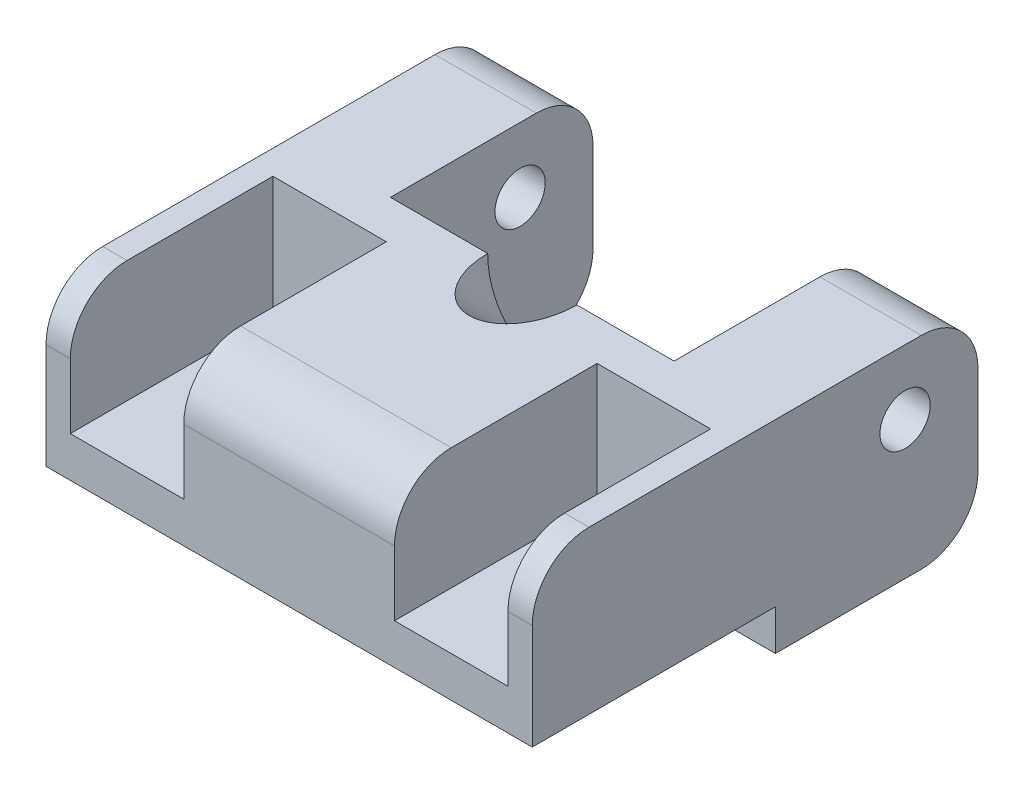
ISO-10303-21;
HEADER;
FILE_DESCRIPTION(('STEP AP214'),'2;1');
FILE_NAME('part.step','',(''),(''),'','','');
FILE_SCHEMA(('AUTOMOTIVE_DESIGN { 1 0 10303 214 1 1 1 1 }'));
ENDSEC;
DATA;
#1=APPLICATION_CONTEXT('core data for automotive mechanical design processes');
#2=APPLICATION_PROTOCOL_DEFINITION('international standard','automotive_design',2000,#1);
#3=PRODUCT_CONTEXT('',#1,'mechanical');
#4=PRODUCT('Part','Part','',(#3));
#5=PRODUCT_RELATED_PRODUCT_CATEGORY('part','',(#4));
#6=PRODUCT_DEFINITION_FORMATION('','',#4);
#7=PRODUCT_DEFINITION_CONTEXT('part definition',#1,'design');
#8=PRODUCT_DEFINITION('design','',#6,#7);
#9=PRODUCT_DEFINITION_SHAPE('','',#8);
#10=(LENGTH_UNIT() NAMED_UNIT(*) SI_UNIT(.MILLI.,.METRE.));
#11=(NAMED_UNIT(*) PLANE_ANGLE_UNIT() SI_UNIT($,.RADIAN.));
#12=(NAMED_UNIT(*) SI_UNIT($,.STERADIAN.) SOLID_ANGLE_UNIT());
#13=UNCERTAINTY_MEASURE_WITH_UNIT(LENGTH_MEASURE(1.E-05),#10,'distance_accuracy_value','');
#14=(GEOMETRIC_REPRESENTATION_CONTEXT(3) GLOBAL_UNCERTAINTY_ASSIGNED_CONTEXT((#13)) GLOBAL_UNIT_ASSIGNED_CONTEXT((#10,
#11,#12)) REPRESENTATION_CONTEXT('',''));
#15=CARTESIAN_POINT('',(0.,0.,0.));
#16=DIRECTION('',(0.,0.,1.));
#17=DIRECTION('',(1.,0.,0.));
#18=AXIS2_PLACEMENT_3D('',#15,#16,#17);
#19=CARTESIAN_POINT('',(0.,-5.,0.));
#20=DIRECTION('',(0.,1.,0.));
#21=DIRECTION('',(0.,0.,1.));
#22=AXIS2_PLACEMENT_3D('',#19,#20,#21);
#23=PLANE('',#22);
#24=DIRECTION('',(0.,0.,1.));
#25=VECTOR('',#24,1.);
#26=CARTESIAN_POINT('',(47.5,-5.,-55.));
#27=LINE('',#26,#25);
#28=CARTESIAN_POINT('',(47.5,-5.,-48.));
#29=VERTEX_POINT('',#28);
#30=CARTESIAN_POINT('',(47.5,-5.,-30.));
#31=VERTEX_POINT('',#30);
#32=EDGE_CURVE('E238',#29,#31,#27,.T.);
#33=ORIENTED_EDGE('',*,*,#32,.F.);
#34=DIRECTION('',(-1.,0.,0.));
#35=VECTOR('',#34,1.);
#36=CARTESIAN_POINT('',(0.,-5.,-48.));
#37=LINE('',#36,#35);
#38=CARTESIAN_POINT('',(60.,-5.,-48.));
#39=VERTEX_POINT('',#38);
#40=EDGE_CURVE('E41',#29,#39,#37,.F.);
#41=ORIENTED_EDGE('',*,*,#40,.T.);
#42=DIRECTION('',(0.,0.,-1.));
#43=VECTOR('',#42,1.);
#44=CARTESIAN_POINT('',(60.,-5.,0.));
#45=LINE('',#44,#43);
#46=CARTESIAN_POINT('',(60.,-5.,-30.));
#47=VERTEX_POINT('',#46);
#48=EDGE_CURVE('E235',#47,#39,#45,.T.);
#49=ORIENTED_EDGE('',*,*,#48,.F.);
#50=DIRECTION('',(-1.,0.,0.));
#51=VECTOR('',#50,1.);
#52=CARTESIAN_POINT('',(90.4138126514911,-5.,-30.));
#53=LINE('',#52,#51);
#54=EDGE_CURVE('E433',#47,#31,#53,.T.);
#55=ORIENTED_EDGE('',*,*,#54,.T.);
#56=EDGE_LOOP('',(#33,#41,#49,#55));
#57=FACE_BOUND('',#56,.T.);
#58=ADVANCED_FACE('F33',(#57),#23,.F.);
#59=CARTESIAN_POINT('',(0.,5.,0.));
#60=DIRECTION('',(0.,-1.,0.));
#61=DIRECTION('',(0.,0.,-1.));
#62=AXIS2_PLACEMENT_3D('',#59,#60,#61);
#63=PLANE('',#62);
#64=CARTESIAN_POINT('',(50.,5.,-15.));
#65=DIRECTION('',(0.,1.,0.));
#66=DIRECTION('',(0.,0.,1.));
#67=AXIS2_PLACEMENT_3D('',#64,#65,#66);
#68=CIRCLE('',#67,2.5);
#69=CARTESIAN_POINT('',(50.,5.,-12.5));
#70=VERTEX_POINT('',#69);
#71=EDGE_CURVE('E284',#70,#70,#68,.T.);
#72=ORIENTED_EDGE('',*,*,#71,.F.);
#73=EDGE_LOOP('',(#72));
#74=FACE_BOUND('',#73,.T.);
#75=DIRECTION('',(1.,0.,0.));
#76=VECTOR('',#75,1.);
#77=CARTESIAN_POINT('',(0.,5.,0.));
#78=LINE('',#77,#76);
#79=CARTESIAN_POINT('',(43.,5.,0.));
#80=VERTEX_POINT('',#79);
#81=CARTESIAN_POINT('',(57.,5.,0.));
#82=VERTEX_POINT('',#81);
#83=EDGE_CURVE('E290',#80,#82,#78,.T.);
#84=ORIENTED_EDGE('',*,*,#83,.T.);
#85=DIRECTION('',(0.,0.,-1.));
#86=VECTOR('',#85,1.);
#87=CARTESIAN_POINT('',(57.,5.,0.));
#88=LINE('',#87,#86);
#89=CARTESIAN_POINT('',(57.,5.,-25.));
#90=VERTEX_POINT('',#89);
#91=EDGE_CURVE('E271',#82,#90,#88,.T.);
#92=ORIENTED_EDGE('',*,*,#91,.T.);
#93=DIRECTION('',(-1.,0.,0.));
#94=VECTOR('',#93,1.);
#95=CARTESIAN_POINT('',(0.,5.,-25.));
#96=LINE('',#95,#94);
#97=CARTESIAN_POINT('',(43.,5.,-25.));
#98=VERTEX_POINT('',#97);
#99=EDGE_CURVE('E275',#90,#98,#96,.T.);
#100=ORIENTED_EDGE('',*,*,#99,.T.);
#101=DIRECTION('',(0.,0.,1.));
#102=VECTOR('',#101,1.);
#103=CARTESIAN_POINT('',(43.,5.,0.));
#104=LINE('',#103,#102);
#105=EDGE_CURVE('E269',#98,#80,#104,.T.);
#106=ORIENTED_EDGE('',*,*,#105,.T.);
#107=EDGE_LOOP('',(#84,#92,#100,#106));
#108=FACE_BOUND('',#107,.T.);
#109=ADVANCED_FACE('F560',(#74,#108),#63,.F.);
#110=CARTESIAN_POINT('',(3.,5.,0.));
#111=VERTEX_POINT('',#110);
#112=CARTESIAN_POINT('',(17.,5.,0.));
#113=VERTEX_POINT('',#112);
#114=EDGE_CURVE('E292',#111,#113,#78,.T.);
#115=ORIENTED_EDGE('',*,*,#114,.T.);
#116=DIRECTION('',(0.,0.,-1.));
#117=VECTOR('',#116,1.);
#118=CARTESIAN_POINT('',(17.,5.,0.));
#119=LINE('',#118,#117);
#120=CARTESIAN_POINT('',(17.,5.,-25.));
#121=VERTEX_POINT('',#120);
#122=EDGE_CURVE('E267',#113,#121,#119,.T.);
#123=ORIENTED_EDGE('',*,*,#122,.T.);
#124=DIRECTION('',(-1.,0.,0.));
#125=VECTOR('',#124,1.);
#126=CARTESIAN_POINT('',(0.,5.,-25.));
#127=LINE('',#126,#125);
#128=CARTESIAN_POINT('',(3.,5.,-25.));
#129=VERTEX_POINT('',#128);
#130=EDGE_CURVE('E273',#121,#129,#127,.T.);
#131=ORIENTED_EDGE('',*,*,#130,.T.);
#132=DIRECTION('',(0.,0.,1.));
#133=VECTOR('',#132,1.);
#134=CARTESIAN_POINT('',(3.,5.,0.));
#135=LINE('',#134,#133);
#136=EDGE_CURVE('E247',#129,#111,#135,.T.);
#137=ORIENTED_EDGE('',*,*,#136,.T.);
#138=EDGE_LOOP('',(#115,#123,#131,#137));
#139=FACE_BOUND('',#138,.T.);
#140=CARTESIAN_POINT('',(10.,5.,-15.));
#141=DIRECTION('',(0.,1.,0.));
#142=DIRECTION('',(0.,0.,1.));
#143=AXIS2_PLACEMENT_3D('',#140,#141,#142);
#144=CIRCLE('',#143,2.5);
#145=CARTESIAN_POINT('',(10.,5.,-12.5));
#146=VERTEX_POINT('',#145);
#147=EDGE_CURVE('E278',#146,#146,#144,.T.);
#148=ORIENTED_EDGE('',*,*,#147,.F.);
#149=EDGE_LOOP('',(#148));
#150=FACE_BOUND('',#149,.T.);
#151=ADVANCED_FACE('F565',(#139,#150),#63,.F.);
#152=CARTESIAN_POINT('',(0.,0.,0.));
#153=DIRECTION('',(0.,-1.,0.));
#154=DIRECTION('',(0.,0.,-1.));
#155=AXIS2_PLACEMENT_3D('',#152,#153,#154);
#156=PLANE('',#155);
#157=DIRECTION('',(1.,0.,0.));
#158=VECTOR('',#157,1.);
#159=CARTESIAN_POINT('',(0.,0.,0.));
#160=LINE('',#159,#158);
#161=CARTESIAN_POINT('',(0.,0.,0.));
#162=VERTEX_POINT('',#161);
#163=CARTESIAN_POINT('',(60.,0.,0.));
#164=VERTEX_POINT('',#163);
#165=EDGE_CURVE('E287',#162,#164,#160,.T.);
#166=ORIENTED_EDGE('',*,*,#165,.F.);
#167=DIRECTION('',(0.,0.,-1.));
#168=VECTOR('',#167,1.);
#169=CARTESIAN_POINT('',(0.,0.,-30.));
#170=LINE('',#169,#168);
#171=CARTESIAN_POINT('',(0.,0.,-30.));
#172=VERTEX_POINT('',#171);
#173=EDGE_CURVE('E442',#162,#172,#170,.T.);
#174=ORIENTED_EDGE('',*,*,#173,.T.);
#175=DIRECTION('',(-1.,0.,0.));
#176=VECTOR('',#175,1.);
#177=CARTESIAN_POINT('',(90.4138126514911,0.,-30.));
#178=LINE('',#177,#176);
#179=CARTESIAN_POINT('',(12.5,0.,-30.));
#180=VERTEX_POINT('',#179);
#181=EDGE_CURVE('E435',#180,#172,#178,.T.);
#182=ORIENTED_EDGE('',*,*,#181,.F.);
#183=CARTESIAN_POINT('',(47.5,0.,-30.));
#184=VERTEX_POINT('',#183);
#185=EDGE_CURVE('E441',#184,#180,#178,.T.);
#186=ORIENTED_EDGE('',*,*,#185,.F.);
#187=CARTESIAN_POINT('',(60.,0.,-30.));
#188=VERTEX_POINT('',#187);
#189=EDGE_CURVE('E437',#188,#184,#178,.T.);
#190=ORIENTED_EDGE('',*,*,#189,.F.);
#191=DIRECTION('',(0.,0.,1.));
#192=VECTOR('',#191,1.);
#193=CARTESIAN_POINT('',(60.,0.,-30.));
#194=LINE('',#193,#192);
#195=EDGE_CURVE('E440',#188,#164,#194,.T.);
#196=ORIENTED_EDGE('',*,*,#195,.T.);
#197=EDGE_LOOP('',(#166,#174,#182,#186,#190,#196));
#198=FACE_BOUND('',#197,.T.);
#199=CARTESIAN_POINT('',(10.,0.,-15.));
#200=DIRECTION('',(0.,1.,0.));
#201=DIRECTION('',(0.,0.,1.));
#202=AXIS2_PLACEMENT_3D('',#199,#200,#201);
#203=CIRCLE('',#202,2.5);
#204=CARTESIAN_POINT('',(10.,0.,-12.5));
#205=VERTEX_POINT('',#204);
#206=EDGE_CURVE('E277',#205,#205,#203,.T.);
#207=ORIENTED_EDGE('',*,*,#206,.T.);
#208=EDGE_LOOP('',(#207));
#209=FACE_BOUND('',#208,.T.);
#210=CARTESIAN_POINT('',(50.,0.,-15.));
#211=DIRECTION('',(0.,1.,0.));
#212=DIRECTION('',(0.,0.,1.));
#213=AXIS2_PLACEMENT_3D('',#210,#211,#212);
#214=CIRCLE('',#213,2.5);
#215=CARTESIAN_POINT('',(50.,0.,-12.5));
#216=VERTEX_POINT('',#215);
#217=EDGE_CURVE('E281',#216,#216,#214,.T.);
#218=ORIENTED_EDGE('',*,*,#217,.T.);
#219=EDGE_LOOP('',(#218));
#220=FACE_BOUND('',#219,.T.);
#221=ADVANCED_FACE('F521',(#198,#209,#220),#156,.T.);
#222=CARTESIAN_POINT('',(0.,5.,0.));
#223=DIRECTION('',(0.,0.,-1.));
#224=DIRECTION('',(-1.,0.,0.));
#225=AXIS2_PLACEMENT_3D('',#222,#223,#224);
#226=PLANE('',#225);
#227=DIRECTION('',(0.,1.,0.));
#228=VECTOR('',#227,1.);
#229=CARTESIAN_POINT('',(43.,-5.,0.));
#230=LINE('',#229,#228);
#231=CARTESIAN_POINT('',(43.,13.,0.));
#232=VERTEX_POINT('',#231);
#233=EDGE_CURVE('E253',#80,#232,#230,.T.);
#234=ORIENTED_EDGE('',*,*,#233,.T.);
#235=DIRECTION('',(1.,0.,0.));
#236=VECTOR('',#235,1.);
#237=CARTESIAN_POINT('',(17.,13.,0.));
#238=LINE('',#237,#236);
#239=CARTESIAN_POINT('',(17.,13.,0.));
#240=VERTEX_POINT('',#239);
#241=EDGE_CURVE('E335',#232,#240,#238,.F.);
#242=ORIENTED_EDGE('',*,*,#241,.T.);
#243=DIRECTION('',(0.,1.,0.));
#244=VECTOR('',#243,1.);
#245=CARTESIAN_POINT('',(17.,-5.,0.));
#246=LINE('',#245,#244);
#247=EDGE_CURVE('E256',#113,#240,#246,.T.);
#248=ORIENTED_EDGE('',*,*,#247,.F.);
#249=ORIENTED_EDGE('',*,*,#114,.F.);
#250=DIRECTION('',(0.,1.,0.));
#251=VECTOR('',#250,1.);
#252=CARTESIAN_POINT('',(3.,-5.,0.));
#253=LINE('',#252,#251);
#254=CARTESIAN_POINT('',(3.,13.,0.));
#255=VERTEX_POINT('',#254);
#256=EDGE_CURVE('E243',#111,#255,#253,.T.);
#257=ORIENTED_EDGE('',*,*,#256,.T.);
#258=DIRECTION('',(1.,0.,0.));
#259=VECTOR('',#258,1.);
#260=CARTESIAN_POINT('',(0.,13.,0.));
#261=LINE('',#260,#259);
#262=CARTESIAN_POINT('',(0.,13.,0.));
#263=VERTEX_POINT('',#262);
#264=EDGE_CURVE('E333',#255,#263,#261,.F.);
#265=ORIENTED_EDGE('',*,*,#264,.T.);
#266=DIRECTION('',(0.,-1.,0.));
#267=VECTOR('',#266,1.);
#268=CARTESIAN_POINT('',(0.,5.,0.));
#269=LINE('',#268,#267);
#270=EDGE_CURVE('E313',#263,#162,#269,.T.);
#271=ORIENTED_EDGE('',*,*,#270,.T.);
#272=ORIENTED_EDGE('',*,*,#165,.T.);
#273=DIRECTION('',(0.,-1.,0.));
#274=VECTOR('',#273,1.);
#275=CARTESIAN_POINT('',(60.,5.,0.));
#276=LINE('',#275,#274);
#277=CARTESIAN_POINT('',(60.,13.,0.));
#278=VERTEX_POINT('',#277);
#279=EDGE_CURVE('E311',#278,#164,#276,.T.);
#280=ORIENTED_EDGE('',*,*,#279,.F.);
#281=DIRECTION('',(1.,0.,0.));
#282=VECTOR('',#281,1.);
#283=CARTESIAN_POINT('',(57.,13.,0.));
#284=LINE('',#283,#282);
#285=CARTESIAN_POINT('',(57.,13.,0.));
#286=VERTEX_POINT('',#285);
#287=EDGE_CURVE('E331',#278,#286,#284,.F.);
#288=ORIENTED_EDGE('',*,*,#287,.T.);
#289=DIRECTION('',(0.,1.,0.));
#290=VECTOR('',#289,1.);
#291=CARTESIAN_POINT('',(57.,-5.,0.));
#292=LINE('',#291,#290);
#293=EDGE_CURVE('E244',#82,#286,#292,.T.);
#294=ORIENTED_EDGE('',*,*,#293,.F.);
#295=ORIENTED_EDGE('',*,*,#83,.F.);
#296=EDGE_LOOP('',(#234,#242,#248,#249,#257,#265,#271,#272,#280,#288,#294,#295));
#297=FACE_BOUND('',#296,.T.);
#298=ADVANCED_FACE('F518',(#297),#226,.F.);
#299=CARTESIAN_POINT('',(60.,5.,-30.));
#300=DIRECTION('',(-1.,0.,0.));
#301=DIRECTION('',(0.,0.,1.));
#302=AXIS2_PLACEMENT_3D('',#299,#300,#301);
#303=PLANE('',#302);
#304=CARTESIAN_POINT('',(60.,12.,-46.));
#305=DIRECTION('',(-1.,0.,0.));
#306=DIRECTION('',(0.,0.,1.));
#307=AXIS2_PLACEMENT_3D('',#304,#305,#306);
#308=CIRCLE('',#307,3.1);
#309=CARTESIAN_POINT('',(60.,12.,-42.9));
#310=VERTEX_POINT('',#309);
#311=EDGE_CURVE('E432',#310,#310,#308,.F.);
#312=ORIENTED_EDGE('',*,*,#311,.F.);
#313=EDGE_LOOP('',(#312));
#314=FACE_BOUND('',#313,.T.);
#315=DIRECTION('',(0.,0.,-1.));
#316=VECTOR('',#315,1.);
#317=CARTESIAN_POINT('',(60.,20.,0.));
#318=LINE('',#317,#316);
#319=CARTESIAN_POINT('',(60.,20.,-7.));
#320=VERTEX_POINT('',#319);
#321=CARTESIAN_POINT('',(60.,20.,-48.));
#322=VERTEX_POINT('',#321);
#323=EDGE_CURVE('E398',#320,#322,#318,.T.);
#324=ORIENTED_EDGE('',*,*,#323,.F.);
#325=CARTESIAN_POINT('',(60.,13.,-7.));
#326=DIRECTION('',(-1.,0.,0.));
#327=DIRECTION('',(0.,0.,1.));
#328=AXIS2_PLACEMENT_3D('',#325,#326,#327);
#329=CIRCLE('',#328,7.);
#330=EDGE_CURVE('E351',#320,#278,#329,.F.);
#331=ORIENTED_EDGE('',*,*,#330,.T.);
#332=ORIENTED_EDGE('',*,*,#279,.T.);
#333=ORIENTED_EDGE('',*,*,#195,.F.);
#334=DIRECTION('',(0.,1.,0.));
#335=VECTOR('',#334,1.);
#336=CARTESIAN_POINT('',(60.,-5.,-30.));
#337=LINE('',#336,#335);
#338=EDGE_CURVE('E385',#47,#188,#337,.T.);
#339=ORIENTED_EDGE('',*,*,#338,.F.);
#340=ORIENTED_EDGE('',*,*,#48,.T.);
#341=CARTESIAN_POINT('',(60.,2.,-48.));
#342=DIRECTION('',(-1.,0.,0.));
#343=DIRECTION('',(0.,0.,1.));
#344=AXIS2_PLACEMENT_3D('',#341,#342,#343);
#345=CIRCLE('',#344,7.);
#346=CARTESIAN_POINT('',(60.,2.,-55.));
#347=VERTEX_POINT('',#346);
#348=EDGE_CURVE('E349',#39,#347,#345,.F.);
#349=ORIENTED_EDGE('',*,*,#348,.T.);
#350=DIRECTION('',(0.,-1.,0.));
#351=VECTOR('',#350,1.);
#352=CARTESIAN_POINT('',(60.,5.,-55.));
#353=LINE('',#352,#351);
#354=CARTESIAN_POINT('',(60.,13.,-55.));
#355=VERTEX_POINT('',#354);
#356=EDGE_CURVE('E308',#355,#347,#353,.T.);
#357=ORIENTED_EDGE('',*,*,#356,.F.);
#358=CARTESIAN_POINT('',(60.,13.,-48.));
#359=DIRECTION('',(-1.,0.,0.));
#360=DIRECTION('',(0.,0.,1.));
#361=AXIS2_PLACEMENT_3D('',#358,#359,#360);
#362=CIRCLE('',#361,7.);
#363=EDGE_CURVE('E347',#355,#322,#362,.F.);
#364=ORIENTED_EDGE('',*,*,#363,.T.);
#365=EDGE_LOOP('',(#324,#331,#332,#333,#339,#340,#349,#357,#364));
#366=FACE_BOUND('',#365,.T.);
#367=ADVANCED_FACE('F382',(#314,#366),#303,.F.);
#368=CARTESIAN_POINT('',(60.,5.,-55.));
#369=DIRECTION('',(0.,0.,1.));
#370=DIRECTION('',(1.,0.,0.));
#371=AXIS2_PLACEMENT_3D('',#368,#369,#370);
#372=PLANE('',#371);
#373=ORIENTED_EDGE('',*,*,#356,.T.);
#374=DIRECTION('',(-1.,0.,0.));
#375=VECTOR('',#374,1.);
#376=CARTESIAN_POINT('',(60.,2.,-55.));
#377=LINE('',#376,#375);
#378=CARTESIAN_POINT('',(47.5,2.,-55.));
#379=VERTEX_POINT('',#378);
#380=EDGE_CURVE('E368',#347,#379,#377,.T.);
#381=ORIENTED_EDGE('',*,*,#380,.T.);
#382=DIRECTION('',(0.,-1.,0.));
#383=VECTOR('',#382,1.);
#384=CARTESIAN_POINT('',(47.5,5.,-55.));
#385=LINE('',#384,#383);
#386=CARTESIAN_POINT('',(47.5,13.,-55.));
#387=VERTEX_POINT('',#386);
#388=EDGE_CURVE('E306',#387,#379,#385,.T.);
#389=ORIENTED_EDGE('',*,*,#388,.F.);
#390=DIRECTION('',(-1.,0.,0.));
#391=VECTOR('',#390,1.);
#392=CARTESIAN_POINT('',(60.,13.,-55.));
#393=LINE('',#392,#391);
#394=EDGE_CURVE('E366',#387,#355,#393,.F.);
#395=ORIENTED_EDGE('',*,*,#394,.T.);
#396=EDGE_LOOP('',(#373,#381,#389,#395));
#397=FACE_BOUND('',#396,.T.);
#398=ADVANCED_FACE('F390',(#397),#372,.F.);
#399=CARTESIAN_POINT('',(47.5,5.,-30.));
#400=DIRECTION('',(1.,0.,0.));
#401=DIRECTION('',(0.,0.,-1.));
#402=AXIS2_PLACEMENT_3D('',#399,#400,#401);
#403=PLANE('',#402);
#404=CARTESIAN_POINT('',(47.5,12.,-46.));
#405=DIRECTION('',(1.,0.,0.));
#406=DIRECTION('',(0.,0.,-1.));
#407=AXIS2_PLACEMENT_3D('',#404,#405,#406);
#408=CIRCLE('',#407,3.1);
#409=CARTESIAN_POINT('',(47.5,12.,-49.1));
#410=VERTEX_POINT('',#409);
#411=EDGE_CURVE('E420',#410,#410,#408,.T.);
#412=ORIENTED_EDGE('',*,*,#411,.T.);
#413=EDGE_LOOP('',(#412));
#414=FACE_BOUND('',#413,.T.);
#415=ORIENTED_EDGE('',*,*,#388,.T.);
#416=CARTESIAN_POINT('',(47.5,2.,-48.));
#417=DIRECTION('',(1.,0.,0.));
#418=DIRECTION('',(0.,0.,-1.));
#419=AXIS2_PLACEMENT_3D('',#416,#417,#418);
#420=CIRCLE('',#419,7.);
#421=EDGE_CURVE('E54',#379,#29,#420,.F.);
#422=ORIENTED_EDGE('',*,*,#421,.T.);
#423=ORIENTED_EDGE('',*,*,#32,.T.);
#424=DIRECTION('',(0.,1.,0.));
#425=VECTOR('',#424,1.);
#426=CARTESIAN_POINT('',(47.5,5.,-30.));
#427=LINE('',#426,#425);
#428=EDGE_CURVE('E426',#31,#184,#427,.T.);
#429=ORIENTED_EDGE('',*,*,#428,.T.);
#430=DIRECTION('',(0.,-1.,0.));
#431=VECTOR('',#430,1.);
#432=CARTESIAN_POINT('',(47.5,5.,-30.));
#433=LINE('',#432,#431);
#434=CARTESIAN_POINT('',(47.5,20.,-30.));
#435=VERTEX_POINT('',#434);
#436=EDGE_CURVE('E304',#435,#184,#433,.T.);
#437=ORIENTED_EDGE('',*,*,#436,.F.);
#438=DIRECTION('',(0.,0.,1.));
#439=VECTOR('',#438,1.);
#440=CARTESIAN_POINT('',(47.5,20.,-55.));
#441=LINE('',#440,#439);
#442=CARTESIAN_POINT('',(47.5,20.,-48.));
#443=VERTEX_POINT('',#442);
#444=EDGE_CURVE('E224',#443,#435,#441,.T.);
#445=ORIENTED_EDGE('',*,*,#444,.F.);
#446=CARTESIAN_POINT('',(47.5,13.,-48.));
#447=DIRECTION('',(1.,0.,0.));
#448=DIRECTION('',(0.,0.,-1.));
#449=AXIS2_PLACEMENT_3D('',#446,#447,#448);
#450=CIRCLE('',#449,7.);
#451=EDGE_CURVE('E371',#443,#387,#450,.F.);
#452=ORIENTED_EDGE('',*,*,#451,.T.);
#453=EDGE_LOOP('',(#415,#422,#423,#429,#437,#445,#452));
#454=FACE_BOUND('',#453,.T.);
#455=ADVANCED_FACE('F392',(#414,#454),#403,.F.);
#456=CARTESIAN_POINT('',(12.5,5.,-30.));
#457=DIRECTION('',(0.,0.,1.));
#458=DIRECTION('',(1.,0.,0.));
#459=AXIS2_PLACEMENT_3D('',#456,#457,#458);
#460=PLANE('',#459);
#461=CARTESIAN_POINT('',(30.,20.,-30.));
#462=DIRECTION('',(0.,0.,1.));
#463=DIRECTION('',(0.,1.,0.));
#464=AXIS2_PLACEMENT_3D('',#461,#462,#463);
#465=ELLIPSE('',#464,7.77817459305203,5.5);
#466=CARTESIAN_POINT('',(35.5,20.,-30.));
#467=VERTEX_POINT('',#466);
#468=CARTESIAN_POINT('',(24.5,20.,-30.));
#469=VERTEX_POINT('',#468);
#470=EDGE_CURVE('E47',#467,#469,#465,.F.);
#471=ORIENTED_EDGE('',*,*,#470,.F.);
#472=DIRECTION('',(-1.,0.,0.));
#473=VECTOR('',#472,1.);
#474=CARTESIAN_POINT('',(47.5,20.,-30.));
#475=LINE('',#474,#473);
#476=EDGE_CURVE('E216',#435,#467,#475,.T.);
#477=ORIENTED_EDGE('',*,*,#476,.F.);
#478=ORIENTED_EDGE('',*,*,#436,.T.);
#479=ORIENTED_EDGE('',*,*,#185,.T.);
#480=DIRECTION('',(0.,-1.,0.));
#481=VECTOR('',#480,1.);
#482=CARTESIAN_POINT('',(12.5,5.,-30.));
#483=LINE('',#482,#481);
#484=CARTESIAN_POINT('',(12.5,20.,-30.));
#485=VERTEX_POINT('',#484);
#486=EDGE_CURVE('E301',#485,#180,#483,.T.);
#487=ORIENTED_EDGE('',*,*,#486,.F.);
#488=EDGE_CURVE('E218',#469,#485,#475,.T.);
#489=ORIENTED_EDGE('',*,*,#488,.F.);
#490=EDGE_LOOP('',(#471,#477,#478,#479,#487,#489));
#491=FACE_BOUND('',#490,.T.);
#492=ADVANCED_FACE('F214',(#491),#460,.F.);
#493=CARTESIAN_POINT('',(12.5,5.,-30.));
#494=DIRECTION('',(-1.,0.,0.));
#495=DIRECTION('',(0.,0.,1.));
#496=AXIS2_PLACEMENT_3D('',#493,#494,#495);
#497=PLANE('',#496);
#498=CARTESIAN_POINT('',(12.5,12.,-46.));
#499=DIRECTION('',(-1.,0.,0.));
#500=DIRECTION('',(0.,0.,1.));
#501=AXIS2_PLACEMENT_3D('',#498,#499,#500);
#502=CIRCLE('',#501,3.1);
#503=CARTESIAN_POINT('',(12.5,12.,-42.9));
#504=VERTEX_POINT('',#503);
#505=EDGE_CURVE('E423',#504,#504,#502,.T.);
#506=ORIENTED_EDGE('',*,*,#505,.T.);
#507=EDGE_LOOP('',(#506));
#508=FACE_BOUND('',#507,.T.);
#509=DIRECTION('',(0.,0.,-1.));
#510=VECTOR('',#509,1.);
#511=CARTESIAN_POINT('',(12.5,-5.,-30.));
#512=LINE('',#511,#510);
#513=CARTESIAN_POINT('',(12.5,-5.,-30.));
#514=VERTEX_POINT('',#513);
#515=CARTESIAN_POINT('',(12.5,-5.,-48.));
#516=VERTEX_POINT('',#515);
#517=EDGE_CURVE('E240',#514,#516,#512,.T.);
#518=ORIENTED_EDGE('',*,*,#517,.T.);
#519=CARTESIAN_POINT('',(12.5,2.,-48.));
#520=DIRECTION('',(-1.,0.,0.));
#521=DIRECTION('',(0.,0.,1.));
#522=AXIS2_PLACEMENT_3D('',#519,#520,#521);
#523=CIRCLE('',#522,7.);
#524=CARTESIAN_POINT('',(12.5,2.,-55.));
#525=VERTEX_POINT('',#524);
#526=EDGE_CURVE('E364',#516,#525,#523,.F.);
#527=ORIENTED_EDGE('',*,*,#526,.T.);
#528=DIRECTION('',(0.,-1.,0.));
#529=VECTOR('',#528,1.);
#530=CARTESIAN_POINT('',(12.5,5.,-55.));
#531=LINE('',#530,#529);
#532=CARTESIAN_POINT('',(12.5,13.,-55.));
#533=VERTEX_POINT('',#532);
#534=EDGE_CURVE('E298',#533,#525,#531,.T.);
#535=ORIENTED_EDGE('',*,*,#534,.F.);
#536=CARTESIAN_POINT('',(12.5,13.,-48.));
#537=DIRECTION('',(-1.,0.,0.));
#538=DIRECTION('',(0.,0.,1.));
#539=AXIS2_PLACEMENT_3D('',#536,#537,#538);
#540=CIRCLE('',#539,7.);
#541=CARTESIAN_POINT('',(12.5,20.,-48.));
#542=VERTEX_POINT('',#541);
#543=EDGE_CURVE('E362',#533,#542,#540,.F.);
#544=ORIENTED_EDGE('',*,*,#543,.T.);
#545=DIRECTION('',(0.,0.,-1.));
#546=VECTOR('',#545,1.);
#547=CARTESIAN_POINT('',(12.5,20.,-30.));
#548=LINE('',#547,#546);
#549=EDGE_CURVE('E226',#485,#542,#548,.T.);
#550=ORIENTED_EDGE('',*,*,#549,.F.);
#551=ORIENTED_EDGE('',*,*,#486,.T.);
#552=DIRECTION('',(0.,-1.,0.));
#553=VECTOR('',#552,1.);
#554=CARTESIAN_POINT('',(12.5,5.,-30.));
#555=LINE('',#554,#553);
#556=EDGE_CURVE('E429',#180,#514,#555,.T.);
#557=ORIENTED_EDGE('',*,*,#556,.T.);
#558=EDGE_LOOP('',(#518,#527,#535,#544,#550,#551,#557));
#559=FACE_BOUND('',#558,.T.);
#560=ADVANCED_FACE('F530',(#508,#559),#497,.F.);
#561=CARTESIAN_POINT('',(0.,5.,-55.));
#562=DIRECTION('',(0.,0.,1.));
#563=DIRECTION('',(1.,0.,0.));
#564=AXIS2_PLACEMENT_3D('',#561,#562,#563);
#565=PLANE('',#564);
#566=ORIENTED_EDGE('',*,*,#534,.T.);
#567=DIRECTION('',(-1.,0.,0.));
#568=VECTOR('',#567,1.);
#569=CARTESIAN_POINT('',(0.,2.,-55.));
#570=LINE('',#569,#568);
#571=CARTESIAN_POINT('',(0.,2.,-55.));
#572=VERTEX_POINT('',#571);
#573=EDGE_CURVE('E357',#525,#572,#570,.T.);
#574=ORIENTED_EDGE('',*,*,#573,.T.);
#575=DIRECTION('',(0.,-1.,0.));
#576=VECTOR('',#575,1.);
#577=CARTESIAN_POINT('',(0.,5.,-55.));
#578=LINE('',#577,#576);
#579=CARTESIAN_POINT('',(0.,13.,-55.));
#580=VERTEX_POINT('',#579);
#581=EDGE_CURVE('E295',#580,#572,#578,.T.);
#582=ORIENTED_EDGE('',*,*,#581,.F.);
#583=DIRECTION('',(-1.,0.,0.));
#584=VECTOR('',#583,1.);
#585=CARTESIAN_POINT('',(12.5,13.,-55.));
#586=LINE('',#585,#584);
#587=EDGE_CURVE('E355',#580,#533,#586,.F.);
#588=ORIENTED_EDGE('',*,*,#587,.T.);
#589=EDGE_LOOP('',(#566,#574,#582,#588));
#590=FACE_BOUND('',#589,.T.);
#591=ADVANCED_FACE('F463',(#590),#565,.F.);
#592=CARTESIAN_POINT('',(0.,5.,-30.));
#593=DIRECTION('',(1.,0.,0.));
#594=DIRECTION('',(0.,0.,-1.));
#595=AXIS2_PLACEMENT_3D('',#592,#593,#594);
#596=PLANE('',#595);
#597=CARTESIAN_POINT('',(0.,12.,-46.));
#598=DIRECTION('',(-1.,0.,0.));
#599=DIRECTION('',(0.,0.,1.));
#600=AXIS2_PLACEMENT_3D('',#597,#598,#599);
#601=CIRCLE('',#600,3.1);
#602=CARTESIAN_POINT('',(0.,12.,-42.9));
#603=VERTEX_POINT('',#602);
#604=EDGE_CURVE('E448',#603,#603,#601,.T.);
#605=ORIENTED_EDGE('',*,*,#604,.F.);
#606=EDGE_LOOP('',(#605));
#607=FACE_BOUND('',#606,.T.);
#608=ORIENTED_EDGE('',*,*,#270,.F.);
#609=CARTESIAN_POINT('',(0.,13.,-7.));
#610=DIRECTION('',(1.,0.,0.));
#611=DIRECTION('',(0.,0.,-1.));
#612=AXIS2_PLACEMENT_3D('',#609,#610,#611);
#613=CIRCLE('',#612,7.);
#614=CARTESIAN_POINT('',(0.,20.,-7.));
#615=VERTEX_POINT('',#614);
#616=EDGE_CURVE('E345',#263,#615,#613,.F.);
#617=ORIENTED_EDGE('',*,*,#616,.T.);
#618=DIRECTION('',(0.,0.,1.));
#619=VECTOR('',#618,1.);
#620=CARTESIAN_POINT('',(0.,20.,-55.));
#621=LINE('',#620,#619);
#622=CARTESIAN_POINT('',(0.,20.,-48.));
#623=VERTEX_POINT('',#622);
#624=EDGE_CURVE('E417',#623,#615,#621,.T.);
#625=ORIENTED_EDGE('',*,*,#624,.F.);
#626=CARTESIAN_POINT('',(0.,13.,-48.));
#627=DIRECTION('',(1.,0.,0.));
#628=DIRECTION('',(0.,0.,-1.));
#629=AXIS2_PLACEMENT_3D('',#626,#627,#628);
#630=CIRCLE('',#629,7.);
#631=EDGE_CURVE('E341',#623,#580,#630,.F.);
#632=ORIENTED_EDGE('',*,*,#631,.T.);
#633=ORIENTED_EDGE('',*,*,#581,.T.);
#634=CARTESIAN_POINT('',(0.,2.,-48.));
#635=DIRECTION('',(1.,0.,0.));
#636=DIRECTION('',(0.,0.,-1.));
#637=AXIS2_PLACEMENT_3D('',#634,#635,#636);
#638=CIRCLE('',#637,7.);
#639=CARTESIAN_POINT('',(0.,-5.,-48.));
#640=VERTEX_POINT('',#639);
#641=EDGE_CURVE('E343',#572,#640,#638,.F.);
#642=ORIENTED_EDGE('',*,*,#641,.T.);
#643=DIRECTION('',(0.,0.,1.));
#644=VECTOR('',#643,1.);
#645=CARTESIAN_POINT('',(0.,-5.,-55.));
#646=LINE('',#645,#644);
#647=CARTESIAN_POINT('',(0.,-5.,-30.));
#648=VERTEX_POINT('',#647);
#649=EDGE_CURVE('E229',#640,#648,#646,.T.);
#650=ORIENTED_EDGE('',*,*,#649,.T.);
#651=DIRECTION('',(0.,-1.,0.));
#652=VECTOR('',#651,1.);
#653=CARTESIAN_POINT('',(0.,-5.,-30.));
#654=LINE('',#653,#652);
#655=EDGE_CURVE('E219',#172,#648,#654,.T.);
#656=ORIENTED_EDGE('',*,*,#655,.F.);
#657=ORIENTED_EDGE('',*,*,#173,.F.);
#658=EDGE_LOOP('',(#608,#617,#625,#632,#633,#642,#650,#656,#657));
#659=FACE_BOUND('',#658,.T.);
#660=ADVANCED_FACE('F459',(#607,#659),#596,.F.);
#661=CARTESIAN_POINT('',(50.,5.,-15.));
#662=DIRECTION('',(0.,-1.,0.));
#663=DIRECTION('',(0.,0.,-1.));
#664=AXIS2_PLACEMENT_3D('',#661,#662,#663);
#665=CYLINDRICAL_SURFACE('',#664,2.5);
#666=ORIENTED_EDGE('',*,*,#71,.T.);
#667=EDGE_LOOP('',(#666));
#668=FACE_BOUND('',#667,.T.);
#669=ORIENTED_EDGE('',*,*,#217,.F.);
#670=EDGE_LOOP('',(#669));
#671=FACE_BOUND('',#670,.T.);
#672=ADVANCED_FACE('F462',(#668,#671),#665,.F.);
#673=CARTESIAN_POINT('',(10.,5.,-15.));
#674=DIRECTION('',(0.,-1.,0.));
#675=DIRECTION('',(0.,0.,-1.));
#676=AXIS2_PLACEMENT_3D('',#673,#674,#675);
#677=CYLINDRICAL_SURFACE('',#676,2.5);
#678=ORIENTED_EDGE('',*,*,#147,.T.);
#679=EDGE_LOOP('',(#678));
#680=FACE_BOUND('',#679,.T.);
#681=ORIENTED_EDGE('',*,*,#206,.F.);
#682=EDGE_LOOP('',(#681));
#683=FACE_BOUND('',#682,.T.);
#684=ADVANCED_FACE('F570',(#680,#683),#677,.F.);
#685=ORIENTED_EDGE('',*,*,#649,.F.);
#686=DIRECTION('',(-1.,0.,0.));
#687=VECTOR('',#686,1.);
#688=CARTESIAN_POINT('',(0.,-5.,-48.));
#689=LINE('',#688,#687);
#690=EDGE_CURVE('E360',#640,#516,#689,.F.);
#691=ORIENTED_EDGE('',*,*,#690,.T.);
#692=ORIENTED_EDGE('',*,*,#517,.F.);
#693=EDGE_CURVE('E436',#514,#648,#53,.T.);
#694=ORIENTED_EDGE('',*,*,#693,.T.);
#695=EDGE_LOOP('',(#685,#691,#692,#694));
#696=FACE_BOUND('',#695,.T.);
#697=ADVANCED_FACE('F547',(#696),#23,.F.);
#698=CARTESIAN_POINT('',(43.,-5.,-25.));
#699=DIRECTION('',(0.,0.,1.));
#700=DIRECTION('',(1.,0.,0.));
#701=AXIS2_PLACEMENT_3D('',#698,#699,#700);
#702=PLANE('',#701);
#703=ORIENTED_EDGE('',*,*,#99,.F.);
#704=DIRECTION('',(0.,1.,0.));
#705=VECTOR('',#704,1.);
#706=CARTESIAN_POINT('',(57.,-5.,-25.));
#707=LINE('',#706,#705);
#708=CARTESIAN_POINT('',(57.,20.,-25.));
#709=VERTEX_POINT('',#708);
#710=EDGE_CURVE('E248',#90,#709,#707,.T.);
#711=ORIENTED_EDGE('',*,*,#710,.T.);
#712=DIRECTION('',(1.,0.,0.));
#713=VECTOR('',#712,1.);
#714=CARTESIAN_POINT('',(43.,20.,-25.));
#715=LINE('',#714,#713);
#716=CARTESIAN_POINT('',(43.,20.,-25.));
#717=VERTEX_POINT('',#716);
#718=EDGE_CURVE('E402',#717,#709,#715,.T.);
#719=ORIENTED_EDGE('',*,*,#718,.F.);
#720=DIRECTION('',(0.,1.,0.));
#721=VECTOR('',#720,1.);
#722=CARTESIAN_POINT('',(43.,-5.,-25.));
#723=LINE('',#722,#721);
#724=EDGE_CURVE('E250',#98,#717,#723,.T.);
#725=ORIENTED_EDGE('',*,*,#724,.F.);
#726=EDGE_LOOP('',(#703,#711,#719,#725));
#727=FACE_BOUND('',#726,.T.);
#728=ADVANCED_FACE('F506',(#727),#702,.T.);
#729=CARTESIAN_POINT('',(3.,-5.,-25.));
#730=DIRECTION('',(0.,0.,1.));
#731=DIRECTION('',(1.,0.,0.));
#732=AXIS2_PLACEMENT_3D('',#729,#730,#731);
#733=PLANE('',#732);
#734=ORIENTED_EDGE('',*,*,#130,.F.);
#735=DIRECTION('',(0.,1.,0.));
#736=VECTOR('',#735,1.);
#737=CARTESIAN_POINT('',(17.,-5.,-25.));
#738=LINE('',#737,#736);
#739=CARTESIAN_POINT('',(17.,20.,-25.));
#740=VERTEX_POINT('',#739);
#741=EDGE_CURVE('E259',#121,#740,#738,.T.);
#742=ORIENTED_EDGE('',*,*,#741,.T.);
#743=DIRECTION('',(1.,0.,0.));
#744=VECTOR('',#743,1.);
#745=CARTESIAN_POINT('',(3.,20.,-25.));
#746=LINE('',#745,#744);
#747=CARTESIAN_POINT('',(3.,20.,-25.));
#748=VERTEX_POINT('',#747);
#749=EDGE_CURVE('E412',#748,#740,#746,.T.);
#750=ORIENTED_EDGE('',*,*,#749,.F.);
#751=DIRECTION('',(0.,1.,0.));
#752=VECTOR('',#751,1.);
#753=CARTESIAN_POINT('',(3.,-5.,-25.));
#754=LINE('',#753,#752);
#755=EDGE_CURVE('E261',#129,#748,#754,.T.);
#756=ORIENTED_EDGE('',*,*,#755,.F.);
#757=EDGE_LOOP('',(#734,#742,#750,#756));
#758=FACE_BOUND('',#757,.T.);
#759=ADVANCED_FACE('F485',(#758),#733,.T.);
#760=CARTESIAN_POINT('',(57.,-5.,0.));
#761=DIRECTION('',(-1.,0.,0.));
#762=DIRECTION('',(0.,0.,1.));
#763=AXIS2_PLACEMENT_3D('',#760,#761,#762);
#764=PLANE('',#763);
#765=ORIENTED_EDGE('',*,*,#293,.T.);
#766=CARTESIAN_POINT('',(57.,13.,-7.));
#767=DIRECTION('',(-1.,0.,0.));
#768=DIRECTION('',(0.,0.,1.));
#769=AXIS2_PLACEMENT_3D('',#766,#767,#768);
#770=CIRCLE('',#769,7.);
#771=CARTESIAN_POINT('',(57.,20.,-7.));
#772=VERTEX_POINT('',#771);
#773=EDGE_CURVE('E353',#286,#772,#770,.T.);
#774=ORIENTED_EDGE('',*,*,#773,.T.);
#775=DIRECTION('',(0.,0.,1.));
#776=VECTOR('',#775,1.);
#777=CARTESIAN_POINT('',(57.,20.,0.));
#778=LINE('',#777,#776);
#779=EDGE_CURVE('E401',#709,#772,#778,.T.);
#780=ORIENTED_EDGE('',*,*,#779,.F.);
#781=ORIENTED_EDGE('',*,*,#710,.F.);
#782=ORIENTED_EDGE('',*,*,#91,.F.);
#783=EDGE_LOOP('',(#765,#774,#780,#781,#782));
#784=FACE_BOUND('',#783,.T.);
#785=ADVANCED_FACE('F510',(#784),#764,.T.);
#786=CARTESIAN_POINT('',(43.,-5.,-25.));
#787=DIRECTION('',(1.,0.,0.));
#788=DIRECTION('',(0.,0.,-1.));
#789=AXIS2_PLACEMENT_3D('',#786,#787,#788);
#790=PLANE('',#789);
#791=DIRECTION('',(0.,0.,-1.));
#792=VECTOR('',#791,1.);
#793=CARTESIAN_POINT('',(43.,20.,-25.));
#794=LINE('',#793,#792);
#795=CARTESIAN_POINT('',(43.,20.,-7.));
#796=VERTEX_POINT('',#795);
#797=EDGE_CURVE('E407',#796,#717,#794,.T.);
#798=ORIENTED_EDGE('',*,*,#797,.F.);
#799=CARTESIAN_POINT('',(43.,13.,-7.));
#800=DIRECTION('',(1.,0.,0.));
#801=DIRECTION('',(0.,0.,-1.));
#802=AXIS2_PLACEMENT_3D('',#799,#800,#801);
#803=CIRCLE('',#802,7.);
#804=EDGE_CURVE('E329',#796,#232,#803,.T.);
#805=ORIENTED_EDGE('',*,*,#804,.T.);
#806=ORIENTED_EDGE('',*,*,#233,.F.);
#807=ORIENTED_EDGE('',*,*,#105,.F.);
#808=ORIENTED_EDGE('',*,*,#724,.T.);
#809=EDGE_LOOP('',(#798,#805,#806,#807,#808));
#810=FACE_BOUND('',#809,.T.);
#811=ADVANCED_FACE('F499',(#810),#790,.T.);
#812=CARTESIAN_POINT('',(17.,-5.,-25.));
#813=DIRECTION('',(-1.,0.,0.));
#814=DIRECTION('',(0.,0.,1.));
#815=AXIS2_PLACEMENT_3D('',#812,#813,#814);
#816=PLANE('',#815);
#817=ORIENTED_EDGE('',*,*,#247,.T.);
#818=CARTESIAN_POINT('',(17.,13.,-7.));
#819=DIRECTION('',(-1.,0.,0.));
#820=DIRECTION('',(0.,0.,1.));
#821=AXIS2_PLACEMENT_3D('',#818,#819,#820);
#822=CIRCLE('',#821,7.);
#823=CARTESIAN_POINT('',(17.,20.,-7.));
#824=VERTEX_POINT('',#823);
#825=EDGE_CURVE('E337',#240,#824,#822,.T.);
#826=ORIENTED_EDGE('',*,*,#825,.T.);
#827=DIRECTION('',(0.,0.,1.));
#828=VECTOR('',#827,1.);
#829=CARTESIAN_POINT('',(17.,20.,-25.));
#830=LINE('',#829,#828);
#831=EDGE_CURVE('E409',#740,#824,#830,.T.);
#832=ORIENTED_EDGE('',*,*,#831,.F.);
#833=ORIENTED_EDGE('',*,*,#741,.F.);
#834=ORIENTED_EDGE('',*,*,#122,.F.);
#835=EDGE_LOOP('',(#817,#826,#832,#833,#834));
#836=FACE_BOUND('',#835,.T.);
#837=ADVANCED_FACE('F490',(#836),#816,.T.);
#838=CARTESIAN_POINT('',(3.,-5.,0.));
#839=DIRECTION('',(1.,0.,0.));
#840=DIRECTION('',(0.,0.,-1.));
#841=AXIS2_PLACEMENT_3D('',#838,#839,#840);
#842=PLANE('',#841);
#843=DIRECTION('',(0.,0.,-1.));
#844=VECTOR('',#843,1.);
#845=CARTESIAN_POINT('',(3.,20.,0.));
#846=LINE('',#845,#844);
#847=CARTESIAN_POINT('',(3.,20.,-7.));
#848=VERTEX_POINT('',#847);
#849=EDGE_CURVE('E415',#848,#748,#846,.T.);
#850=ORIENTED_EDGE('',*,*,#849,.F.);
#851=CARTESIAN_POINT('',(3.,13.,-7.));
#852=DIRECTION('',(1.,0.,0.));
#853=DIRECTION('',(0.,0.,-1.));
#854=AXIS2_PLACEMENT_3D('',#851,#852,#853);
#855=CIRCLE('',#854,7.);
#856=EDGE_CURVE('E339',#848,#255,#855,.T.);
#857=ORIENTED_EDGE('',*,*,#856,.T.);
#858=ORIENTED_EDGE('',*,*,#256,.F.);
#859=ORIENTED_EDGE('',*,*,#136,.F.);
#860=ORIENTED_EDGE('',*,*,#755,.T.);
#861=EDGE_LOOP('',(#850,#857,#858,#859,#860));
#862=FACE_BOUND('',#861,.T.);
#863=ADVANCED_FACE('F478',(#862),#842,.T.);
#864=CARTESIAN_POINT('',(0.,20.,0.));
#865=DIRECTION('',(0.,1.,0.));
#866=DIRECTION('',(0.,0.,1.));
#867=AXIS2_PLACEMENT_3D('',#864,#865,#866);
#868=PLANE('',#867);
#869=ORIENTED_EDGE('',*,*,#476,.T.);
#870=CARTESIAN_POINT('',(30.,20.,-30.));
#871=DIRECTION('',(0.,1.,0.));
#872=DIRECTION('',(0.,0.,1.));
#873=AXIS2_PLACEMENT_3D('',#870,#871,#872);
#874=ELLIPSE('',#873,7.778174593052,5.5);
#875=EDGE_CURVE('E11',#467,#469,#874,.F.);
#876=ORIENTED_EDGE('',*,*,#875,.T.);
#877=ORIENTED_EDGE('',*,*,#488,.T.);
#878=ORIENTED_EDGE('',*,*,#549,.T.);
#879=DIRECTION('',(-1.,0.,0.));
#880=VECTOR('',#879,1.);
#881=CARTESIAN_POINT('',(0.,20.,-48.));
#882=LINE('',#881,#880);
#883=EDGE_CURVE('E315',#542,#623,#882,.T.);
#884=ORIENTED_EDGE('',*,*,#883,.T.);
#885=ORIENTED_EDGE('',*,*,#624,.T.);
#886=DIRECTION('',(1.,0.,0.));
#887=VECTOR('',#886,1.);
#888=CARTESIAN_POINT('',(3.,20.,-7.));
#889=LINE('',#888,#887);
#890=EDGE_CURVE('E323',#615,#848,#889,.T.);
#891=ORIENTED_EDGE('',*,*,#890,.T.);
#892=ORIENTED_EDGE('',*,*,#849,.T.);
#893=ORIENTED_EDGE('',*,*,#749,.T.);
#894=ORIENTED_EDGE('',*,*,#831,.T.);
#895=DIRECTION('',(1.,0.,0.));
#896=VECTOR('',#895,1.);
#897=CARTESIAN_POINT('',(43.,20.,-7.));
#898=LINE('',#897,#896);
#899=EDGE_CURVE('E326',#824,#796,#898,.T.);
#900=ORIENTED_EDGE('',*,*,#899,.T.);
#901=ORIENTED_EDGE('',*,*,#797,.T.);
#902=ORIENTED_EDGE('',*,*,#718,.T.);
#903=ORIENTED_EDGE('',*,*,#779,.T.);
#904=DIRECTION('',(1.,0.,0.));
#905=VECTOR('',#904,1.);
#906=CARTESIAN_POINT('',(60.,20.,-7.));
#907=LINE('',#906,#905);
#908=EDGE_CURVE('E320',#772,#320,#907,.T.);
#909=ORIENTED_EDGE('',*,*,#908,.T.);
#910=ORIENTED_EDGE('',*,*,#323,.T.);
#911=DIRECTION('',(-1.,0.,0.));
#912=VECTOR('',#911,1.);
#913=CARTESIAN_POINT('',(47.5,20.,-48.));
#914=LINE('',#913,#912);
#915=EDGE_CURVE('E318',#322,#443,#914,.T.);
#916=ORIENTED_EDGE('',*,*,#915,.T.);
#917=ORIENTED_EDGE('',*,*,#444,.T.);
#918=EDGE_LOOP('',(#869,#876,#877,#878,#884,#885,#891,#892,#893,#894,#900,#901,#902,#903,#909,
#910,#916,#917));
#919=FACE_BOUND('',#918,.T.);
#920=ADVANCED_FACE('F221',(#919),#868,.T.);
#921=CARTESIAN_POINT('',(90.4138126514911,-5.,-30.));
#922=DIRECTION('',(0.,0.,-1.));
#923=DIRECTION('',(-1.,0.,0.));
#924=AXIS2_PLACEMENT_3D('',#921,#922,#923);
#925=PLANE('',#924);
#926=ORIENTED_EDGE('',*,*,#54,.F.);
#927=ORIENTED_EDGE('',*,*,#338,.T.);
#928=ORIENTED_EDGE('',*,*,#189,.T.);
#929=ORIENTED_EDGE('',*,*,#428,.F.);
#930=EDGE_LOOP('',(#926,#927,#928,#929));
#931=FACE_BOUND('',#930,.T.);
#932=ADVANCED_FACE('F527',(#931),#925,.F.);
#933=ORIENTED_EDGE('',*,*,#181,.T.);
#934=ORIENTED_EDGE('',*,*,#655,.T.);
#935=ORIENTED_EDGE('',*,*,#693,.F.);
#936=ORIENTED_EDGE('',*,*,#556,.F.);
#937=EDGE_LOOP('',(#933,#934,#935,#936));
#938=FACE_BOUND('',#937,.T.);
#939=ADVANCED_FACE('F549',(#938),#925,.F.);
#940=CARTESIAN_POINT('',(90.4138126514911,12.,-46.));
#941=DIRECTION('',(-1.,0.,0.));
#942=DIRECTION('',(0.,0.,1.));
#943=AXIS2_PLACEMENT_3D('',#940,#941,#942);
#944=CYLINDRICAL_SURFACE('',#943,3.1);
#945=ORIENTED_EDGE('',*,*,#604,.T.);
#946=EDGE_LOOP('',(#945));
#947=FACE_BOUND('',#946,.T.);
#948=ORIENTED_EDGE('',*,*,#505,.F.);
#949=EDGE_LOOP('',(#948));
#950=FACE_BOUND('',#949,.T.);
#951=ADVANCED_FACE('F456',(#947,#950),#944,.F.);
#952=ORIENTED_EDGE('',*,*,#311,.T.);
#953=EDGE_LOOP('',(#952));
#954=FACE_BOUND('',#953,.T.);
#955=ORIENTED_EDGE('',*,*,#411,.F.);
#956=EDGE_LOOP('',(#955));
#957=FACE_BOUND('',#956,.T.);
#958=ADVANCED_FACE('F556',(#954,#957),#944,.F.);
#959=CARTESIAN_POINT('',(0.,13.,-7.));
#960=DIRECTION('',(-1.,0.,0.));
#961=DIRECTION('',(0.,0.,1.));
#962=AXIS2_PLACEMENT_3D('',#959,#960,#961);
#963=CYLINDRICAL_SURFACE('',#962,7.);
#964=ORIENTED_EDGE('',*,*,#825,.F.);
#965=ORIENTED_EDGE('',*,*,#241,.F.);
#966=ORIENTED_EDGE('',*,*,#804,.F.);
#967=ORIENTED_EDGE('',*,*,#899,.F.);
#968=EDGE_LOOP('',(#964,#965,#966,#967));
#969=FACE_BOUND('',#968,.T.);
#970=ADVANCED_FACE('F496',(#969),#963,.T.);
#971=CARTESIAN_POINT('',(0.,13.,-7.));
#972=DIRECTION('',(-1.,0.,0.));
#973=DIRECTION('',(0.,0.,1.));
#974=AXIS2_PLACEMENT_3D('',#971,#972,#973);
#975=CYLINDRICAL_SURFACE('',#974,7.);
#976=ORIENTED_EDGE('',*,*,#616,.F.);
#977=ORIENTED_EDGE('',*,*,#264,.F.);
#978=ORIENTED_EDGE('',*,*,#856,.F.);
#979=ORIENTED_EDGE('',*,*,#890,.F.);
#980=EDGE_LOOP('',(#976,#977,#978,#979));
#981=FACE_BOUND('',#980,.T.);
#982=ADVANCED_FACE('F475',(#981),#975,.T.);
#983=CARTESIAN_POINT('',(0.,13.,-7.));
#984=DIRECTION('',(-1.,0.,0.));
#985=DIRECTION('',(0.,0.,1.));
#986=AXIS2_PLACEMENT_3D('',#983,#984,#985);
#987=CYLINDRICAL_SURFACE('',#986,7.);
#988=ORIENTED_EDGE('',*,*,#773,.F.);
#989=ORIENTED_EDGE('',*,*,#287,.F.);
#990=ORIENTED_EDGE('',*,*,#330,.F.);
#991=ORIENTED_EDGE('',*,*,#908,.F.);
#992=EDGE_LOOP('',(#988,#989,#990,#991));
#993=FACE_BOUND('',#992,.T.);
#994=ADVANCED_FACE('F516',(#993),#987,.T.);
#995=CARTESIAN_POINT('',(0.,2.,-48.));
#996=DIRECTION('',(-1.,0.,0.));
#997=DIRECTION('',(0.,0.,1.));
#998=AXIS2_PLACEMENT_3D('',#995,#996,#997);
#999=CYLINDRICAL_SURFACE('',#998,7.);
#1000=ORIENTED_EDGE('',*,*,#526,.F.);
#1001=ORIENTED_EDGE('',*,*,#690,.F.);
#1002=ORIENTED_EDGE('',*,*,#641,.F.);
#1003=ORIENTED_EDGE('',*,*,#573,.F.);
#1004=EDGE_LOOP('',(#1000,#1001,#1002,#1003));
#1005=FACE_BOUND('',#1004,.T.);
#1006=ADVANCED_FACE('F542',(#1005),#999,.T.);
#1007=CARTESIAN_POINT('',(60.,2.,-48.));
#1008=DIRECTION('',(-1.,0.,0.));
#1009=DIRECTION('',(0.,0.,1.));
#1010=AXIS2_PLACEMENT_3D('',#1007,#1008,#1009);
#1011=CYLINDRICAL_SURFACE('',#1010,7.);
#1012=ORIENTED_EDGE('',*,*,#348,.F.);
#1013=ORIENTED_EDGE('',*,*,#40,.F.);
#1014=ORIENTED_EDGE('',*,*,#421,.F.);
#1015=ORIENTED_EDGE('',*,*,#380,.F.);
#1016=EDGE_LOOP('',(#1012,#1013,#1014,#1015));
#1017=FACE_BOUND('',#1016,.T.);
#1018=ADVANCED_FACE('F387',(#1017),#1011,.T.);
#1019=CARTESIAN_POINT('',(0.,13.,-48.));
#1020=DIRECTION('',(1.,0.,0.));
#1021=DIRECTION('',(0.,0.,-1.));
#1022=AXIS2_PLACEMENT_3D('',#1019,#1020,#1021);
#1023=CYLINDRICAL_SURFACE('',#1022,7.);
#1024=ORIENTED_EDGE('',*,*,#363,.F.);
#1025=ORIENTED_EDGE('',*,*,#394,.F.);
#1026=ORIENTED_EDGE('',*,*,#451,.F.);
#1027=ORIENTED_EDGE('',*,*,#915,.F.);
#1028=EDGE_LOOP('',(#1024,#1025,#1026,#1027));
#1029=FACE_BOUND('',#1028,.T.);
#1030=ADVANCED_FACE('F396',(#1029),#1023,.T.);
#1031=CARTESIAN_POINT('',(0.,13.,-48.));
#1032=DIRECTION('',(1.,0.,0.));
#1033=DIRECTION('',(0.,0.,-1.));
#1034=AXIS2_PLACEMENT_3D('',#1031,#1032,#1033);
#1035=CYLINDRICAL_SURFACE('',#1034,7.);
#1036=ORIENTED_EDGE('',*,*,#543,.F.);
#1037=ORIENTED_EDGE('',*,*,#587,.F.);
#1038=ORIENTED_EDGE('',*,*,#631,.F.);
#1039=ORIENTED_EDGE('',*,*,#883,.F.);
#1040=EDGE_LOOP('',(#1036,#1037,#1038,#1039));
#1041=FACE_BOUND('',#1040,.T.);
#1042=ADVANCED_FACE('F35',(#1041),#1035,.T.);
#1043=CARTESIAN_POINT('',(30.,12.9289321881345,-37.0710678118655));
#1044=DIRECTION('',(0.,0.707106781186549,0.707106781186546));
#1045=DIRECTION('',(0.,-0.707106781186546,0.707106781186549));
#1046=AXIS2_PLACEMENT_3D('',#1043,#1044,#1045);
#1047=CYLINDRICAL_SURFACE('',#1046,5.5);
#1048=ORIENTED_EDGE('',*,*,#470,.T.);
#1049=ORIENTED_EDGE('',*,*,#875,.F.);
#1050=EDGE_LOOP('',(#1048,#1049));
#1051=FACE_BOUND('',#1050,.T.);
#1052=ADVANCED_FACE('F208',(#1051),#1047,.F.);
#1053=CLOSED_SHELL('',(#58,#109,#151,#221,#298,#367,#398,#455,#492,#560,#591,#660,#672,#684,
#697,#728,#759,#785,#811,#837,#863,#920,#932,#939,#951,#958,#970,#982,#994,#1006,#1018,#1030,
#1042,#1052));
#1054=MANIFOLD_SOLID_BREP('B2',#1053);
#1055=ADVANCED_BREP_SHAPE_REPRESENTATION('',(#18,#1054),#14);
#1056=SHAPE_DEFINITION_REPRESENTATION(#9,#1055);
ENDSEC;
END-ISO-10303-21;
